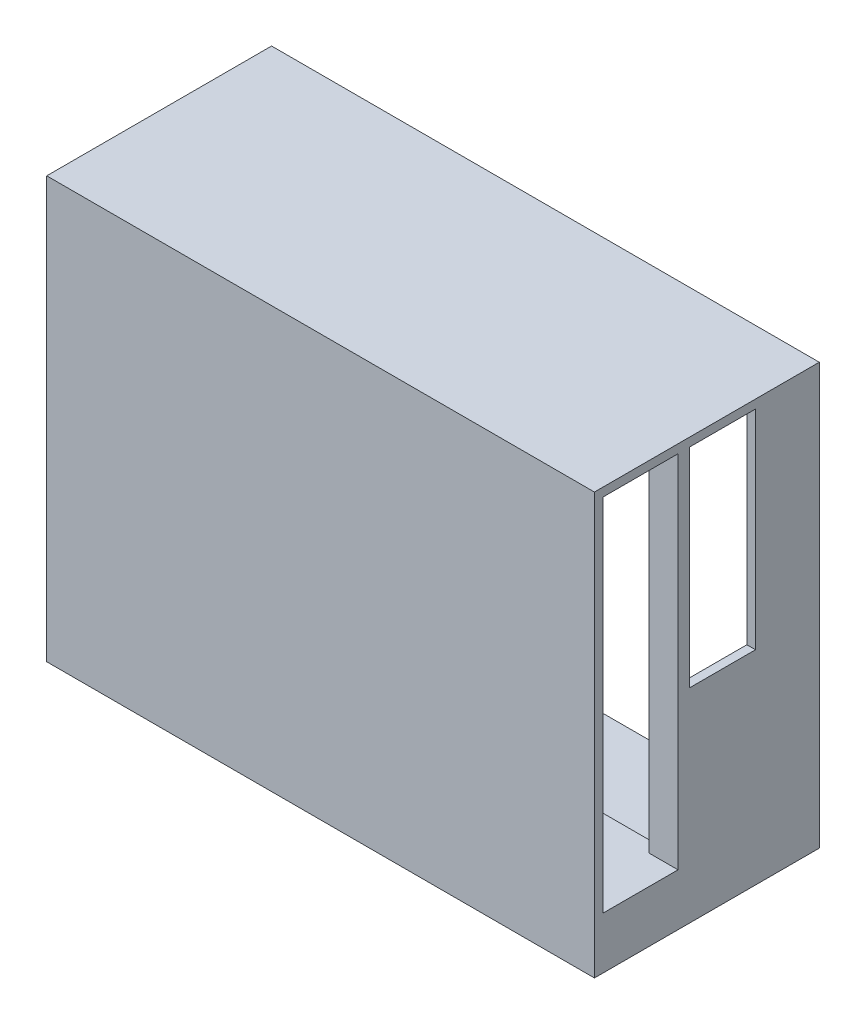
ISO-10303-21;
HEADER;
FILE_DESCRIPTION(('STEP AP214'),'2;1');
FILE_NAME('part.step','',(''),(''),'','','');
FILE_SCHEMA(('AUTOMOTIVE_DESIGN { 1 0 10303 214 1 1 1 1 }'));
ENDSEC;
DATA;
#1=APPLICATION_CONTEXT('core data for automotive mechanical design processes');
#2=APPLICATION_PROTOCOL_DEFINITION('international standard','automotive_design',2000,#1);
#3=PRODUCT_CONTEXT('',#1,'mechanical');
#4=PRODUCT('Part','Part','',(#3));
#5=PRODUCT_RELATED_PRODUCT_CATEGORY('part','',(#4));
#6=PRODUCT_DEFINITION_FORMATION('','',#4);
#7=PRODUCT_DEFINITION_CONTEXT('part definition',#1,'design');
#8=PRODUCT_DEFINITION('design','',#6,#7);
#9=PRODUCT_DEFINITION_SHAPE('','',#8);
#10=(LENGTH_UNIT() NAMED_UNIT(*) SI_UNIT(.MILLI.,.METRE.));
#11=(NAMED_UNIT(*) PLANE_ANGLE_UNIT() SI_UNIT($,.RADIAN.));
#12=(NAMED_UNIT(*) SI_UNIT($,.STERADIAN.) SOLID_ANGLE_UNIT());
#13=UNCERTAINTY_MEASURE_WITH_UNIT(LENGTH_MEASURE(1.E-05),#10,'distance_accuracy_value','');
#14=(GEOMETRIC_REPRESENTATION_CONTEXT(3) GLOBAL_UNCERTAINTY_ASSIGNED_CONTEXT((#13)) GLOBAL_UNIT_ASSIGNED_CONTEXT((#10,
#11,#12)) REPRESENTATION_CONTEXT('',''));
#15=CARTESIAN_POINT('',(0.,0.,0.));
#16=DIRECTION('',(0.,0.,1.));
#17=DIRECTION('',(1.,0.,0.));
#18=AXIS2_PLACEMENT_3D('',#15,#16,#17);
#19=CARTESIAN_POINT('',(95.,-70.,-75.));
#20=DIRECTION('',(0.,-1.,0.));
#21=DIRECTION('',(0.,0.,-1.));
#22=AXIS2_PLACEMENT_3D('',#19,#20,#21);
#23=PLANE('',#22);
#24=DIRECTION('',(1.,0.,0.));
#25=VECTOR('',#24,1.);
#26=CARTESIAN_POINT('',(95.,-70.,-27.));
#27=LINE('',#26,#25);
#28=CARTESIAN_POINT('',(-91.9998664938504,-70.,-27.));
#29=VERTEX_POINT('',#28);
#30=CARTESIAN_POINT('',(-47.,-70.,-27.));
#31=VERTEX_POINT('',#30);
#32=EDGE_CURVE('E241',#29,#31,#27,.T.);
#33=ORIENTED_EDGE('',*,*,#32,.F.);
#34=DIRECTION('',(0.,0.,-1.));
#35=VECTOR('',#34,1.);
#36=CARTESIAN_POINT('',(-91.9998664938504,-70.,-75.));
#37=LINE('',#36,#35);
#38=CARTESIAN_POINT('',(-91.9998664938504,-70.,-30.));
#39=VERTEX_POINT('',#38);
#40=EDGE_CURVE('E225',#29,#39,#37,.T.);
#41=ORIENTED_EDGE('',*,*,#40,.T.);
#42=DIRECTION('',(-1.,0.,0.));
#43=VECTOR('',#42,1.);
#44=CARTESIAN_POINT('',(-42.,-70.,-30.));
#45=LINE('',#44,#43);
#46=CARTESIAN_POINT('',(92.,-70.,-30.));
#47=VERTEX_POINT('',#46);
#48=EDGE_CURVE('E336',#47,#39,#45,.T.);
#49=ORIENTED_EDGE('',*,*,#48,.F.);
#50=DIRECTION('',(0.,0.,1.));
#51=VECTOR('',#50,1.);
#52=CARTESIAN_POINT('',(92.,-70.,-75.));
#53=LINE('',#52,#51);
#54=CARTESIAN_POINT('',(92.,-70.,-75.));
#55=VERTEX_POINT('',#54);
#56=EDGE_CURVE('E384',#55,#47,#53,.T.);
#57=ORIENTED_EDGE('',*,*,#56,.F.);
#58=DIRECTION('',(1.,0.,0.));
#59=VECTOR('',#58,1.);
#60=CARTESIAN_POINT('',(95.,-70.,-75.));
#61=LINE('',#60,#59);
#62=CARTESIAN_POINT('',(-92.,-70.,-75.));
#63=VERTEX_POINT('',#62);
#64=EDGE_CURVE('E414',#63,#55,#61,.T.);
#65=ORIENTED_EDGE('',*,*,#64,.F.);
#66=DIRECTION('',(0.,0.,1.));
#67=VECTOR('',#66,1.);
#68=CARTESIAN_POINT('',(-92.,-70.,-75.));
#69=LINE('',#68,#67);
#70=CARTESIAN_POINT('',(-92.,-70.,0.));
#71=VERTEX_POINT('',#70);
#72=EDGE_CURVE('E390',#63,#71,#69,.T.);
#73=ORIENTED_EDGE('',*,*,#72,.T.);
#74=DIRECTION('',(1.,0.,0.));
#75=VECTOR('',#74,1.);
#76=CARTESIAN_POINT('',(95.,-70.,0.));
#77=LINE('',#76,#75);
#78=CARTESIAN_POINT('',(-47.,-70.,0.));
#79=VERTEX_POINT('',#78);
#80=EDGE_CURVE('E409',#71,#79,#77,.T.);
#81=ORIENTED_EDGE('',*,*,#80,.T.);
#82=DIRECTION('',(0.,0.,1.));
#83=VECTOR('',#82,1.);
#84=CARTESIAN_POINT('',(-47.,-70.,-30.));
#85=LINE('',#84,#83);
#86=EDGE_CURVE('E342',#31,#79,#85,.T.);
#87=ORIENTED_EDGE('',*,*,#86,.F.);
#88=EDGE_LOOP('',(#33,#41,#49,#57,#65,#73,#81,#87));
#89=FACE_BOUND('',#88,.T.);
#90=ADVANCED_FACE('F36',(#89),#23,.F.);
#91=CARTESIAN_POINT('',(-47.,56.4195425973253,-30.));
#92=DIRECTION('',(1.,0.,0.));
#93=DIRECTION('',(0.,1.,0.));
#94=AXIS2_PLACEMENT_3D('',#91,#92,#93);
#95=PLANE('',#94);
#96=DIRECTION('',(0.,-1.,0.));
#97=VECTOR('',#96,1.);
#98=CARTESIAN_POINT('',(-47.,-59.642589744385,-27.));
#99=LINE('',#98,#97);
#100=CARTESIAN_POINT('',(-47.,-59.642589744385,-27.));
#101=VERTEX_POINT('',#100);
#102=EDGE_CURVE('E229',#101,#31,#99,.T.);
#103=ORIENTED_EDGE('',*,*,#102,.T.);
#104=ORIENTED_EDGE('',*,*,#86,.T.);
#105=DIRECTION('',(0.,1.,0.));
#106=VECTOR('',#105,1.);
#107=CARTESIAN_POINT('',(-47.,56.4195425973253,0.));
#108=LINE('',#107,#106);
#109=CARTESIAN_POINT('',(-47.,56.4195425973253,0.));
#110=VERTEX_POINT('',#109);
#111=EDGE_CURVE('E334',#79,#110,#108,.T.);
#112=ORIENTED_EDGE('',*,*,#111,.T.);
#113=DIRECTION('',(0.,0.,1.));
#114=VECTOR('',#113,1.);
#115=CARTESIAN_POINT('',(-47.,56.4195425973253,-30.));
#116=LINE('',#115,#114);
#117=CARTESIAN_POINT('',(-47.,56.4195425973253,-25.));
#118=VERTEX_POINT('',#117);
#119=EDGE_CURVE('E338',#118,#110,#116,.T.);
#120=ORIENTED_EDGE('',*,*,#119,.F.);
#121=DIRECTION('',(0.,-1.,0.));
#122=VECTOR('',#121,1.);
#123=CARTESIAN_POINT('',(-47.,56.4195425973253,-25.));
#124=LINE('',#123,#122);
#125=CARTESIAN_POINT('',(-47.,-59.642589744385,-25.));
#126=VERTEX_POINT('',#125);
#127=EDGE_CURVE('E324',#118,#126,#124,.T.);
#128=ORIENTED_EDGE('',*,*,#127,.T.);
#129=DIRECTION('',(0.,0.,-1.));
#130=VECTOR('',#129,1.);
#131=CARTESIAN_POINT('',(-47.,-59.642589744385,-25.));
#132=LINE('',#131,#130);
#133=EDGE_CURVE('E330',#126,#101,#132,.T.);
#134=ORIENTED_EDGE('',*,*,#133,.T.);
#135=EDGE_LOOP('',(#103,#104,#112,#120,#128,#134));
#136=FACE_BOUND('',#135,.T.);
#137=ADVANCED_FACE('F464',(#136),#95,.F.);
#138=CARTESIAN_POINT('',(92.,-70.,-75.));
#139=DIRECTION('',(1.,0.,0.));
#140=DIRECTION('',(0.,0.,-1.));
#141=AXIS2_PLACEMENT_3D('',#138,#139,#140);
#142=PLANE('',#141);
#143=DIRECTION('',(0.,-1.,0.));
#144=VECTOR('',#143,1.);
#145=CARTESIAN_POINT('',(92.,-70.,-30.));
#146=LINE('',#145,#144);
#147=CARTESIAN_POINT('',(92.,-2.32237524224388,-30.));
#148=VERTEX_POINT('',#147);
#149=EDGE_CURVE('E311',#148,#47,#146,.T.);
#150=ORIENTED_EDGE('',*,*,#149,.F.);
#151=DIRECTION('',(0.,0.,1.));
#152=VECTOR('',#151,1.);
#153=CARTESIAN_POINT('',(92.,-2.32237524224388,-30.));
#154=LINE('',#153,#152);
#155=CARTESIAN_POINT('',(92.,-2.32237524224388,-52.8810215341764));
#156=VERTEX_POINT('',#155);
#157=EDGE_CURVE('E259',#156,#148,#154,.T.);
#158=ORIENTED_EDGE('',*,*,#157,.F.);
#159=DIRECTION('',(0.,-1.,0.));
#160=VECTOR('',#159,1.);
#161=CARTESIAN_POINT('',(92.,70.,-52.8810215341764));
#162=LINE('',#161,#160);
#163=CARTESIAN_POINT('',(92.,70.,-52.8810215341764));
#164=VERTEX_POINT('',#163);
#165=EDGE_CURVE('E248',#164,#156,#162,.T.);
#166=ORIENTED_EDGE('',*,*,#165,.F.);
#167=DIRECTION('',(0.,0.,1.));
#168=VECTOR('',#167,1.);
#169=CARTESIAN_POINT('',(92.,70.,-75.));
#170=LINE('',#169,#168);
#171=CARTESIAN_POINT('',(92.,70.,-75.));
#172=VERTEX_POINT('',#171);
#173=EDGE_CURVE('E382',#172,#164,#170,.T.);
#174=ORIENTED_EDGE('',*,*,#173,.F.);
#175=DIRECTION('',(0.,1.,0.));
#176=VECTOR('',#175,1.);
#177=CARTESIAN_POINT('',(92.,-70.,-75.));
#178=LINE('',#177,#176);
#179=EDGE_CURVE('E379',#55,#172,#178,.T.);
#180=ORIENTED_EDGE('',*,*,#179,.F.);
#181=ORIENTED_EDGE('',*,*,#56,.T.);
#182=EDGE_LOOP('',(#150,#158,#166,#174,#180,#181));
#183=FACE_BOUND('',#182,.T.);
#184=ADVANCED_FACE('F471',(#183),#142,.F.);
#185=CARTESIAN_POINT('',(95.,70.,-75.));
#186=DIRECTION('',(0.,1.,0.));
#187=DIRECTION('',(-1.,0.,0.));
#188=AXIS2_PLACEMENT_3D('',#185,#186,#187);
#189=PLANE('',#188);
#190=DIRECTION('',(1.,0.,0.));
#191=VECTOR('',#190,1.);
#192=CARTESIAN_POINT('',(85.,70.,-30.));
#193=LINE('',#192,#191);
#194=CARTESIAN_POINT('',(85.,70.,-30.));
#195=VERTEX_POINT('',#194);
#196=CARTESIAN_POINT('',(95.,70.,-30.));
#197=VERTEX_POINT('',#196);
#198=EDGE_CURVE('E279',#195,#197,#193,.T.);
#199=ORIENTED_EDGE('',*,*,#198,.F.);
#200=DIRECTION('',(0.,0.,-1.));
#201=VECTOR('',#200,1.);
#202=CARTESIAN_POINT('',(85.,70.,-30.));
#203=LINE('',#202,#201);
#204=CARTESIAN_POINT('',(85.,70.,-26.));
#205=VERTEX_POINT('',#204);
#206=EDGE_CURVE('E276',#205,#195,#203,.T.);
#207=ORIENTED_EDGE('',*,*,#206,.F.);
#208=DIRECTION('',(-1.,0.,0.));
#209=VECTOR('',#208,1.);
#210=CARTESIAN_POINT('',(97.,70.,-26.));
#211=LINE('',#210,#209);
#212=CARTESIAN_POINT('',(95.,70.,-26.));
#213=VERTEX_POINT('',#212);
#214=EDGE_CURVE('E367',#213,#205,#211,.T.);
#215=ORIENTED_EDGE('',*,*,#214,.F.);
#216=DIRECTION('',(0.,0.,-1.));
#217=VECTOR('',#216,1.);
#218=CARTESIAN_POINT('',(95.,70.,3.));
#219=LINE('',#218,#217);
#220=CARTESIAN_POINT('',(95.,70.,0.));
#221=VERTEX_POINT('',#220);
#222=EDGE_CURVE('E370',#221,#213,#219,.T.);
#223=ORIENTED_EDGE('',*,*,#222,.F.);
#224=DIRECTION('',(-1.,0.,0.));
#225=VECTOR('',#224,1.);
#226=CARTESIAN_POINT('',(95.,70.,0.));
#227=LINE('',#226,#225);
#228=CARTESIAN_POINT('',(-42.,70.,0.));
#229=VERTEX_POINT('',#228);
#230=EDGE_CURVE('E396',#221,#229,#227,.T.);
#231=ORIENTED_EDGE('',*,*,#230,.T.);
#232=DIRECTION('',(0.,0.,1.));
#233=VECTOR('',#232,1.);
#234=CARTESIAN_POINT('',(-42.,70.,-30.));
#235=LINE('',#234,#233);
#236=CARTESIAN_POINT('',(-42.,70.,-30.));
#237=VERTEX_POINT('',#236);
#238=EDGE_CURVE('E364',#237,#229,#235,.T.);
#239=ORIENTED_EDGE('',*,*,#238,.F.);
#240=DIRECTION('',(1.,0.,0.));
#241=VECTOR('',#240,1.);
#242=CARTESIAN_POINT('',(-92.,70.,-30.));
#243=LINE('',#242,#241);
#244=CARTESIAN_POINT('',(-92.,70.,-30.));
#245=VERTEX_POINT('',#244);
#246=EDGE_CURVE('E350',#245,#237,#243,.T.);
#247=ORIENTED_EDGE('',*,*,#246,.F.);
#248=DIRECTION('',(0.,0.,1.));
#249=VECTOR('',#248,1.);
#250=CARTESIAN_POINT('',(-92.,70.,-75.));
#251=LINE('',#250,#249);
#252=CARTESIAN_POINT('',(-92.,70.,-75.));
#253=VERTEX_POINT('',#252);
#254=EDGE_CURVE('E394',#253,#245,#251,.T.);
#255=ORIENTED_EDGE('',*,*,#254,.F.);
#256=DIRECTION('',(-1.,0.,0.));
#257=VECTOR('',#256,1.);
#258=CARTESIAN_POINT('',(95.,70.,-75.));
#259=LINE('',#258,#257);
#260=EDGE_CURVE('E397',#172,#253,#259,.T.);
#261=ORIENTED_EDGE('',*,*,#260,.F.);
#262=ORIENTED_EDGE('',*,*,#173,.T.);
#263=DIRECTION('',(-1.,0.,0.));
#264=VECTOR('',#263,1.);
#265=CARTESIAN_POINT('',(170.855567410226,70.,-52.8810215341764));
#266=LINE('',#265,#264);
#267=CARTESIAN_POINT('',(95.,70.,-52.8810215341764));
#268=VERTEX_POINT('',#267);
#269=EDGE_CURVE('E60',#268,#164,#266,.T.);
#270=ORIENTED_EDGE('',*,*,#269,.F.);
#271=DIRECTION('',(0.,0.,1.));
#272=VECTOR('',#271,1.);
#273=CARTESIAN_POINT('',(95.,70.,-30.));
#274=LINE('',#273,#272);
#275=EDGE_CURVE('E256',#268,#197,#274,.T.);
#276=ORIENTED_EDGE('',*,*,#275,.T.);
#277=EDGE_LOOP('',(#199,#207,#215,#223,#231,#239,#247,#255,#261,#262,#270,#276));
#278=FACE_BOUND('',#277,.T.);
#279=ADVANCED_FACE('F508',(#278),#189,.F.);
#280=CARTESIAN_POINT('',(-42.,-55.,-30.));
#281=DIRECTION('',(0.,-1.,0.));
#282=DIRECTION('',(1.,0.,0.));
#283=AXIS2_PLACEMENT_3D('',#280,#281,#282);
#284=PLANE('',#283);
#285=DIRECTION('',(-1.,0.,0.));
#286=VECTOR('',#285,1.);
#287=CARTESIAN_POINT('',(97.,-55.,-26.));
#288=LINE('',#287,#286);
#289=CARTESIAN_POINT('',(95.,-55.,-26.));
#290=VERTEX_POINT('',#289);
#291=CARTESIAN_POINT('',(85.,-55.,-26.));
#292=VERTEX_POINT('',#291);
#293=EDGE_CURVE('E316',#290,#292,#288,.T.);
#294=ORIENTED_EDGE('',*,*,#293,.T.);
#295=DIRECTION('',(0.,0.,1.));
#296=VECTOR('',#295,1.);
#297=CARTESIAN_POINT('',(85.,-55.,-30.));
#298=LINE('',#297,#296);
#299=CARTESIAN_POINT('',(85.,-55.,-30.));
#300=VERTEX_POINT('',#299);
#301=EDGE_CURVE('E270',#300,#292,#298,.T.);
#302=ORIENTED_EDGE('',*,*,#301,.F.);
#303=DIRECTION('',(1.,0.,0.));
#304=VECTOR('',#303,1.);
#305=CARTESIAN_POINT('',(-42.,-55.,-30.));
#306=LINE('',#305,#304);
#307=CARTESIAN_POINT('',(-42.,-55.,-30.));
#308=VERTEX_POINT('',#307);
#309=EDGE_CURVE('E297',#308,#300,#306,.T.);
#310=ORIENTED_EDGE('',*,*,#309,.F.);
#311=DIRECTION('',(0.,0.,1.));
#312=VECTOR('',#311,1.);
#313=CARTESIAN_POINT('',(-42.,-55.,-30.));
#314=LINE('',#313,#312);
#315=CARTESIAN_POINT('',(-42.,-55.,0.));
#316=VERTEX_POINT('',#315);
#317=EDGE_CURVE('E309',#308,#316,#314,.T.);
#318=ORIENTED_EDGE('',*,*,#317,.T.);
#319=DIRECTION('',(1.,0.,0.));
#320=VECTOR('',#319,1.);
#321=CARTESIAN_POINT('',(-42.,-55.,0.));
#322=LINE('',#321,#320);
#323=CARTESIAN_POINT('',(95.,-55.,0.));
#324=VERTEX_POINT('',#323);
#325=EDGE_CURVE('E296',#316,#324,#322,.T.);
#326=ORIENTED_EDGE('',*,*,#325,.T.);
#327=DIRECTION('',(0.,0.,1.));
#328=VECTOR('',#327,1.);
#329=CARTESIAN_POINT('',(95.,-55.,-30.));
#330=LINE('',#329,#328);
#331=EDGE_CURVE('E307',#290,#324,#330,.T.);
#332=ORIENTED_EDGE('',*,*,#331,.F.);
#333=EDGE_LOOP('',(#294,#302,#310,#318,#326,#332));
#334=FACE_BOUND('',#333,.T.);
#335=ADVANCED_FACE('F504',(#334),#284,.F.);
#336=CARTESIAN_POINT('',(0.,0.,0.));
#337=DIRECTION('',(0.,0.,-1.));
#338=DIRECTION('',(-1.,0.,0.));
#339=AXIS2_PLACEMENT_3D('',#336,#337,#338);
#340=PLANE('',#339);
#341=DIRECTION('',(0.,1.,0.));
#342=VECTOR('',#341,1.);
#343=CARTESIAN_POINT('',(95.,73.,0.));
#344=LINE('',#343,#342);
#345=EDGE_CURVE('E377',#324,#221,#344,.T.);
#346=ORIENTED_EDGE('',*,*,#345,.F.);
#347=ORIENTED_EDGE('',*,*,#325,.F.);
#348=DIRECTION('',(0.,-1.,0.));
#349=VECTOR('',#348,1.);
#350=CARTESIAN_POINT('',(-42.,70.,0.));
#351=LINE('',#350,#349);
#352=EDGE_CURVE('E358',#229,#316,#351,.T.);
#353=ORIENTED_EDGE('',*,*,#352,.F.);
#354=ORIENTED_EDGE('',*,*,#230,.F.);
#355=EDGE_LOOP('',(#346,#347,#353,#354));
#356=FACE_BOUND('',#355,.T.);
#357=ADVANCED_FACE('F507',(#356),#340,.T.);
#358=CARTESIAN_POINT('',(97.,-70.,-26.));
#359=DIRECTION('',(0.,0.,-1.));
#360=DIRECTION('',(-1.,0.,0.));
#361=AXIS2_PLACEMENT_3D('',#358,#359,#360);
#362=PLANE('',#361);
#363=ORIENTED_EDGE('',*,*,#293,.F.);
#364=DIRECTION('',(0.,-1.,0.));
#365=VECTOR('',#364,1.);
#366=CARTESIAN_POINT('',(95.,73.,-26.));
#367=LINE('',#366,#365);
#368=EDGE_CURVE('E374',#213,#290,#367,.T.);
#369=ORIENTED_EDGE('',*,*,#368,.F.);
#370=ORIENTED_EDGE('',*,*,#214,.T.);
#371=DIRECTION('',(0.,1.,0.));
#372=VECTOR('',#371,1.);
#373=CARTESIAN_POINT('',(85.,-55.,-26.));
#374=LINE('',#373,#372);
#375=EDGE_CURVE('E273',#292,#205,#374,.T.);
#376=ORIENTED_EDGE('',*,*,#375,.F.);
#377=EDGE_LOOP('',(#363,#369,#370,#376));
#378=FACE_BOUND('',#377,.T.);
#379=ADVANCED_FACE('F525',(#378),#362,.F.);
#380=CARTESIAN_POINT('',(-42.,70.,-30.));
#381=DIRECTION('',(-1.,0.,0.));
#382=DIRECTION('',(0.,-1.,0.));
#383=AXIS2_PLACEMENT_3D('',#380,#381,#382);
#384=PLANE('',#383);
#385=ORIENTED_EDGE('',*,*,#317,.F.);
#386=DIRECTION('',(0.,-1.,0.));
#387=VECTOR('',#386,1.);
#388=CARTESIAN_POINT('',(-42.,70.,-30.));
#389=LINE('',#388,#387);
#390=EDGE_CURVE('E354',#237,#308,#389,.T.);
#391=ORIENTED_EDGE('',*,*,#390,.F.);
#392=ORIENTED_EDGE('',*,*,#238,.T.);
#393=ORIENTED_EDGE('',*,*,#352,.T.);
#394=EDGE_LOOP('',(#385,#391,#392,#393));
#395=FACE_BOUND('',#394,.T.);
#396=ADVANCED_FACE('F499',(#395),#384,.F.);
#397=DIRECTION('',(-1.,0.,0.));
#398=VECTOR('',#397,1.);
#399=CARTESIAN_POINT('',(-92.,56.4195425973253,0.));
#400=LINE('',#399,#398);
#401=CARTESIAN_POINT('',(-92.,56.4195425973253,0.));
#402=VERTEX_POINT('',#401);
#403=EDGE_CURVE('E351',#110,#402,#400,.T.);
#404=ORIENTED_EDGE('',*,*,#403,.F.);
#405=ORIENTED_EDGE('',*,*,#111,.F.);
#406=ORIENTED_EDGE('',*,*,#80,.F.);
#407=DIRECTION('',(0.,-1.,0.));
#408=VECTOR('',#407,1.);
#409=CARTESIAN_POINT('',(-92.,-70.,0.));
#410=LINE('',#409,#408);
#411=EDGE_CURVE('E387',#402,#71,#410,.T.);
#412=ORIENTED_EDGE('',*,*,#411,.F.);
#413=EDGE_LOOP('',(#404,#405,#406,#412));
#414=FACE_BOUND('',#413,.T.);
#415=ADVANCED_FACE('F521',(#414),#340,.T.);
#416=CARTESIAN_POINT('',(-92.,56.4195425973253,-30.));
#417=DIRECTION('',(0.,1.,0.));
#418=DIRECTION('',(-1.,0.,0.));
#419=AXIS2_PLACEMENT_3D('',#416,#417,#418);
#420=PLANE('',#419);
#421=DIRECTION('',(0.,0.,1.));
#422=VECTOR('',#421,1.);
#423=CARTESIAN_POINT('',(-92.,56.4195425973253,-30.));
#424=LINE('',#423,#422);
#425=CARTESIAN_POINT('',(-92.,56.4195425973253,-25.));
#426=VERTEX_POINT('',#425);
#427=EDGE_CURVE('E357',#426,#402,#424,.T.);
#428=ORIENTED_EDGE('',*,*,#427,.F.);
#429=DIRECTION('',(1.,0.,0.));
#430=VECTOR('',#429,1.);
#431=CARTESIAN_POINT('',(-92.,56.4195425973253,-25.));
#432=LINE('',#431,#430);
#433=EDGE_CURVE('E321',#426,#118,#432,.T.);
#434=ORIENTED_EDGE('',*,*,#433,.T.);
#435=ORIENTED_EDGE('',*,*,#119,.T.);
#436=ORIENTED_EDGE('',*,*,#403,.T.);
#437=EDGE_LOOP('',(#428,#434,#435,#436));
#438=FACE_BOUND('',#437,.T.);
#439=ADVANCED_FACE('F460',(#438),#420,.F.);
#440=CARTESIAN_POINT('',(-92.,-70.,-75.));
#441=DIRECTION('',(-1.,0.,0.));
#442=DIRECTION('',(0.,-1.,0.));
#443=AXIS2_PLACEMENT_3D('',#440,#441,#442);
#444=PLANE('',#443);
#445=DIRECTION('',(0.,0.,-1.));
#446=VECTOR('',#445,1.);
#447=CARTESIAN_POINT('',(-92.,-59.642589744385,-25.));
#448=LINE('',#447,#446);
#449=CARTESIAN_POINT('',(-92.,-59.642589744385,-25.));
#450=VERTEX_POINT('',#449);
#451=CARTESIAN_POINT('',(-92.,-59.642589744385,-30.));
#452=VERTEX_POINT('',#451);
#453=EDGE_CURVE('E332',#450,#452,#448,.T.);
#454=ORIENTED_EDGE('',*,*,#453,.F.);
#455=DIRECTION('',(0.,1.,0.));
#456=VECTOR('',#455,1.);
#457=CARTESIAN_POINT('',(-92.,56.4195425973253,-25.));
#458=LINE('',#457,#456);
#459=EDGE_CURVE('E318',#450,#426,#458,.T.);
#460=ORIENTED_EDGE('',*,*,#459,.T.);
#461=ORIENTED_EDGE('',*,*,#427,.T.);
#462=ORIENTED_EDGE('',*,*,#411,.T.);
#463=ORIENTED_EDGE('',*,*,#72,.F.);
#464=DIRECTION('',(0.,-1.,0.));
#465=VECTOR('',#464,1.);
#466=CARTESIAN_POINT('',(-92.,-70.,-75.));
#467=LINE('',#466,#465);
#468=EDGE_CURVE('E388',#253,#63,#467,.T.);
#469=ORIENTED_EDGE('',*,*,#468,.F.);
#470=ORIENTED_EDGE('',*,*,#254,.T.);
#471=DIRECTION('',(0.,1.,0.));
#472=VECTOR('',#471,1.);
#473=CARTESIAN_POINT('',(-92.,70.,-30.));
#474=LINE('',#473,#472);
#475=EDGE_CURVE('E347',#452,#245,#474,.T.);
#476=ORIENTED_EDGE('',*,*,#475,.F.);
#477=EDGE_LOOP('',(#454,#460,#461,#462,#463,#469,#470,#476));
#478=FACE_BOUND('',#477,.T.);
#479=ADVANCED_FACE('F455',(#478),#444,.F.);
#480=CARTESIAN_POINT('',(-95.,73.,3.));
#481=DIRECTION('',(1.,0.,0.));
#482=DIRECTION('',(0.,1.,0.));
#483=AXIS2_PLACEMENT_3D('',#480,#481,#482);
#484=PLANE('',#483);
#485=DIRECTION('',(0.,0.,-1.));
#486=VECTOR('',#485,1.);
#487=CARTESIAN_POINT('',(-95.,73.,3.));
#488=LINE('',#487,#486);
#489=CARTESIAN_POINT('',(-95.,73.,3.));
#490=VERTEX_POINT('',#489);
#491=CARTESIAN_POINT('',(-95.,73.,-75.));
#492=VERTEX_POINT('',#491);
#493=EDGE_CURVE('E428',#490,#492,#488,.T.);
#494=ORIENTED_EDGE('',*,*,#493,.T.);
#495=DIRECTION('',(0.,1.,0.));
#496=VECTOR('',#495,1.);
#497=CARTESIAN_POINT('',(-95.,-73.,-75.));
#498=LINE('',#497,#496);
#499=CARTESIAN_POINT('',(-95.,-73.,-75.));
#500=VERTEX_POINT('',#499);
#501=EDGE_CURVE('E412',#500,#492,#498,.T.);
#502=ORIENTED_EDGE('',*,*,#501,.F.);
#503=DIRECTION('',(0.,0.,-1.));
#504=VECTOR('',#503,1.);
#505=CARTESIAN_POINT('',(-95.,-73.,3.));
#506=LINE('',#505,#504);
#507=CARTESIAN_POINT('',(-95.,-73.,3.));
#508=VERTEX_POINT('',#507);
#509=EDGE_CURVE('E11',#508,#500,#506,.T.);
#510=ORIENTED_EDGE('',*,*,#509,.F.);
#511=DIRECTION('',(0.,-1.,0.));
#512=VECTOR('',#511,1.);
#513=CARTESIAN_POINT('',(-95.,73.,3.));
#514=LINE('',#513,#512);
#515=EDGE_CURVE('E417',#490,#508,#514,.T.);
#516=ORIENTED_EDGE('',*,*,#515,.F.);
#517=EDGE_LOOP('',(#494,#502,#510,#516));
#518=FACE_BOUND('',#517,.T.);
#519=ADVANCED_FACE('F38',(#518),#484,.F.);
#520=CARTESIAN_POINT('',(95.,-73.,3.));
#521=DIRECTION('',(0.,1.,0.));
#522=DIRECTION('',(-1.,0.,0.));
#523=AXIS2_PLACEMENT_3D('',#520,#521,#522);
#524=PLANE('',#523);
#525=ORIENTED_EDGE('',*,*,#509,.T.);
#526=DIRECTION('',(-1.,0.,0.));
#527=VECTOR('',#526,1.);
#528=CARTESIAN_POINT('',(95.,-73.,-75.));
#529=LINE('',#528,#527);
#530=CARTESIAN_POINT('',(95.,-73.,-75.));
#531=VERTEX_POINT('',#530);
#532=EDGE_CURVE('E408',#531,#500,#529,.T.);
#533=ORIENTED_EDGE('',*,*,#532,.F.);
#534=DIRECTION('',(0.,0.,-1.));
#535=VECTOR('',#534,1.);
#536=CARTESIAN_POINT('',(95.,-73.,3.));
#537=LINE('',#536,#535);
#538=CARTESIAN_POINT('',(95.,-73.,3.));
#539=VERTEX_POINT('',#538);
#540=EDGE_CURVE('E45',#539,#531,#537,.T.);
#541=ORIENTED_EDGE('',*,*,#540,.F.);
#542=DIRECTION('',(1.,0.,0.));
#543=VECTOR('',#542,1.);
#544=CARTESIAN_POINT('',(95.,-73.,3.));
#545=LINE('',#544,#543);
#546=EDGE_CURVE('E422',#508,#539,#545,.T.);
#547=ORIENTED_EDGE('',*,*,#546,.F.);
#548=EDGE_LOOP('',(#525,#533,#541,#547));
#549=FACE_BOUND('',#548,.T.);
#550=ADVANCED_FACE('F440',(#549),#524,.F.);
#551=CARTESIAN_POINT('',(95.,73.,3.));
#552=DIRECTION('',(-1.,0.,0.));
#553=DIRECTION('',(0.,-1.,0.));
#554=AXIS2_PLACEMENT_3D('',#551,#552,#553);
#555=PLANE('',#554);
#556=DIRECTION('',(0.,0.,-1.));
#557=VECTOR('',#556,1.);
#558=CARTESIAN_POINT('',(95.,-2.32237524224388,-30.));
#559=LINE('',#558,#557);
#560=CARTESIAN_POINT('',(95.,-2.32237524224388,-30.));
#561=VERTEX_POINT('',#560);
#562=CARTESIAN_POINT('',(95.,-2.32237524224388,-52.8810215341764));
#563=VERTEX_POINT('',#562);
#564=EDGE_CURVE('E251',#561,#563,#559,.T.);
#565=ORIENTED_EDGE('',*,*,#564,.F.);
#566=DIRECTION('',(0.,-1.,0.));
#567=VECTOR('',#566,1.);
#568=CARTESIAN_POINT('',(95.,70.,-30.));
#569=LINE('',#568,#567);
#570=EDGE_CURVE('E254',#197,#561,#569,.T.);
#571=ORIENTED_EDGE('',*,*,#570,.F.);
#572=ORIENTED_EDGE('',*,*,#275,.F.);
#573=DIRECTION('',(0.,1.,0.));
#574=VECTOR('',#573,1.);
#575=CARTESIAN_POINT('',(95.,70.,-52.8810215341764));
#576=LINE('',#575,#574);
#577=EDGE_CURVE('E249',#563,#268,#576,.T.);
#578=ORIENTED_EDGE('',*,*,#577,.F.);
#579=EDGE_LOOP('',(#565,#571,#572,#578));
#580=FACE_BOUND('',#579,.T.);
#581=ORIENTED_EDGE('',*,*,#368,.T.);
#582=ORIENTED_EDGE('',*,*,#331,.T.);
#583=ORIENTED_EDGE('',*,*,#345,.T.);
#584=ORIENTED_EDGE('',*,*,#222,.T.);
#585=EDGE_LOOP('',(#581,#582,#583,#584));
#586=FACE_BOUND('',#585,.T.);
#587=ORIENTED_EDGE('',*,*,#540,.T.);
#588=DIRECTION('',(0.,-1.,0.));
#589=VECTOR('',#588,1.);
#590=CARTESIAN_POINT('',(95.,-73.,-75.));
#591=LINE('',#590,#589);
#592=CARTESIAN_POINT('',(95.,73.,-75.));
#593=VERTEX_POINT('',#592);
#594=EDGE_CURVE('E405',#593,#531,#591,.T.);
#595=ORIENTED_EDGE('',*,*,#594,.F.);
#596=DIRECTION('',(0.,0.,-1.));
#597=VECTOR('',#596,1.);
#598=CARTESIAN_POINT('',(95.,73.,3.));
#599=LINE('',#598,#597);
#600=CARTESIAN_POINT('',(95.,73.,3.));
#601=VERTEX_POINT('',#600);
#602=EDGE_CURVE('E431',#601,#593,#599,.T.);
#603=ORIENTED_EDGE('',*,*,#602,.F.);
#604=DIRECTION('',(0.,1.,0.));
#605=VECTOR('',#604,1.);
#606=CARTESIAN_POINT('',(95.,73.,3.));
#607=LINE('',#606,#605);
#608=EDGE_CURVE('E424',#539,#601,#607,.T.);
#609=ORIENTED_EDGE('',*,*,#608,.F.);
#610=EDGE_LOOP('',(#587,#595,#603,#609));
#611=FACE_BOUND('',#610,.T.);
#612=ADVANCED_FACE('F437',(#580,#586,#611),#555,.F.);
#613=CARTESIAN_POINT('',(95.,73.,3.));
#614=DIRECTION('',(0.,-1.,0.));
#615=DIRECTION('',(1.,0.,0.));
#616=AXIS2_PLACEMENT_3D('',#613,#614,#615);
#617=PLANE('',#616);
#618=ORIENTED_EDGE('',*,*,#602,.T.);
#619=DIRECTION('',(1.,0.,0.));
#620=VECTOR('',#619,1.);
#621=CARTESIAN_POINT('',(95.,73.,-75.));
#622=LINE('',#621,#620);
#623=EDGE_CURVE('E399',#492,#593,#622,.T.);
#624=ORIENTED_EDGE('',*,*,#623,.F.);
#625=ORIENTED_EDGE('',*,*,#493,.F.);
#626=DIRECTION('',(-1.,0.,0.));
#627=VECTOR('',#626,1.);
#628=CARTESIAN_POINT('',(95.,73.,3.));
#629=LINE('',#628,#627);
#630=EDGE_CURVE('E426',#601,#490,#629,.T.);
#631=ORIENTED_EDGE('',*,*,#630,.F.);
#632=EDGE_LOOP('',(#618,#624,#625,#631));
#633=FACE_BOUND('',#632,.T.);
#634=ADVANCED_FACE('F448',(#633),#617,.F.);
#635=CARTESIAN_POINT('',(0.,0.,3.));
#636=DIRECTION('',(0.,0.,-1.));
#637=DIRECTION('',(-1.,0.,0.));
#638=AXIS2_PLACEMENT_3D('',#635,#636,#637);
#639=PLANE('',#638);
#640=ORIENTED_EDGE('',*,*,#515,.T.);
#641=ORIENTED_EDGE('',*,*,#546,.T.);
#642=ORIENTED_EDGE('',*,*,#608,.T.);
#643=ORIENTED_EDGE('',*,*,#630,.T.);
#644=EDGE_LOOP('',(#640,#641,#642,#643));
#645=FACE_BOUND('',#644,.T.);
#646=ADVANCED_FACE('F452',(#645),#639,.F.);
#647=CARTESIAN_POINT('',(0.,0.,-75.));
#648=DIRECTION('',(0.,0.,1.));
#649=DIRECTION('',(1.,0.,0.));
#650=AXIS2_PLACEMENT_3D('',#647,#648,#649);
#651=PLANE('',#650);
#652=ORIENTED_EDGE('',*,*,#64,.T.);
#653=ORIENTED_EDGE('',*,*,#179,.T.);
#654=ORIENTED_EDGE('',*,*,#260,.T.);
#655=ORIENTED_EDGE('',*,*,#468,.T.);
#656=EDGE_LOOP('',(#652,#653,#654,#655));
#657=FACE_BOUND('',#656,.T.);
#658=ORIENTED_EDGE('',*,*,#594,.T.);
#659=ORIENTED_EDGE('',*,*,#532,.T.);
#660=ORIENTED_EDGE('',*,*,#501,.T.);
#661=ORIENTED_EDGE('',*,*,#623,.T.);
#662=EDGE_LOOP('',(#658,#659,#660,#661));
#663=FACE_BOUND('',#662,.T.);
#664=ADVANCED_FACE('F444',(#657,#663),#651,.F.);
#665=CARTESIAN_POINT('',(0.,0.,-30.));
#666=DIRECTION('',(0.,0.,1.));
#667=DIRECTION('',(1.,0.,0.));
#668=AXIS2_PLACEMENT_3D('',#665,#666,#667);
#669=PLANE('',#668);
#670=ORIENTED_EDGE('',*,*,#198,.T.);
#671=ORIENTED_EDGE('',*,*,#570,.T.);
#672=DIRECTION('',(-1.,0.,0.));
#673=VECTOR('',#672,1.);
#674=CARTESIAN_POINT('',(170.855567410226,-2.32237524224388,-30.));
#675=LINE('',#674,#673);
#676=EDGE_CURVE('E252',#561,#148,#675,.T.);
#677=ORIENTED_EDGE('',*,*,#676,.T.);
#678=ORIENTED_EDGE('',*,*,#149,.T.);
#679=ORIENTED_EDGE('',*,*,#48,.T.);
#680=DIRECTION('',(0.,1.,0.));
#681=VECTOR('',#680,1.);
#682=CARTESIAN_POINT('',(-91.9998664938504,-59.642589744385,-30.));
#683=LINE('',#682,#681);
#684=CARTESIAN_POINT('',(-91.9998664938504,-59.642589744385,-30.));
#685=VERTEX_POINT('',#684);
#686=EDGE_CURVE('E245',#39,#685,#683,.T.);
#687=ORIENTED_EDGE('',*,*,#686,.T.);
#688=DIRECTION('',(-1.,0.,0.));
#689=VECTOR('',#688,1.);
#690=CARTESIAN_POINT('',(-92.,-59.642589744385,-30.));
#691=LINE('',#690,#689);
#692=EDGE_CURVE('E240',#685,#452,#691,.T.);
#693=ORIENTED_EDGE('',*,*,#692,.T.);
#694=ORIENTED_EDGE('',*,*,#475,.T.);
#695=ORIENTED_EDGE('',*,*,#246,.T.);
#696=ORIENTED_EDGE('',*,*,#390,.T.);
#697=ORIENTED_EDGE('',*,*,#309,.T.);
#698=DIRECTION('',(0.,-1.,0.));
#699=VECTOR('',#698,1.);
#700=CARTESIAN_POINT('',(85.,-55.,-30.));
#701=LINE('',#700,#699);
#702=EDGE_CURVE('E267',#195,#300,#701,.T.);
#703=ORIENTED_EDGE('',*,*,#702,.F.);
#704=EDGE_LOOP('',(#670,#671,#677,#678,#679,#687,#693,#694,#695,#696,#697,#703));
#705=FACE_BOUND('',#704,.T.);
#706=ADVANCED_FACE('F515',(#705),#669,.F.);
#707=CARTESIAN_POINT('',(-92.,-59.642589744385,-25.));
#708=DIRECTION('',(0.,-1.,0.));
#709=DIRECTION('',(1.,0.,0.));
#710=AXIS2_PLACEMENT_3D('',#707,#708,#709);
#711=PLANE('',#710);
#712=DIRECTION('',(0.,0.,-1.));
#713=VECTOR('',#712,1.);
#714=CARTESIAN_POINT('',(-91.9998664938504,-59.642589744385,-27.));
#715=LINE('',#714,#713);
#716=CARTESIAN_POINT('',(-91.9998664938504,-59.642589744385,-27.));
#717=VERTEX_POINT('',#716);
#718=EDGE_CURVE('E52',#717,#685,#715,.T.);
#719=ORIENTED_EDGE('',*,*,#718,.F.);
#720=DIRECTION('',(1.,0.,0.));
#721=VECTOR('',#720,1.);
#722=CARTESIAN_POINT('',(-47.,-59.642589744385,-27.));
#723=LINE('',#722,#721);
#724=EDGE_CURVE('E228',#717,#101,#723,.T.);
#725=ORIENTED_EDGE('',*,*,#724,.T.);
#726=ORIENTED_EDGE('',*,*,#133,.F.);
#727=DIRECTION('',(-1.,0.,0.));
#728=VECTOR('',#727,1.);
#729=CARTESIAN_POINT('',(-92.,-59.642589744385,-25.));
#730=LINE('',#729,#728);
#731=EDGE_CURVE('E327',#126,#450,#730,.T.);
#732=ORIENTED_EDGE('',*,*,#731,.T.);
#733=ORIENTED_EDGE('',*,*,#453,.T.);
#734=ORIENTED_EDGE('',*,*,#692,.F.);
#735=EDGE_LOOP('',(#719,#725,#726,#732,#733,#734));
#736=FACE_BOUND('',#735,.T.);
#737=ADVANCED_FACE('F238',(#736),#711,.T.);
#738=CARTESIAN_POINT('',(0.,0.,-25.));
#739=DIRECTION('',(0.,0.,1.));
#740=DIRECTION('',(1.,0.,0.));
#741=AXIS2_PLACEMENT_3D('',#738,#739,#740);
#742=PLANE('',#741);
#743=ORIENTED_EDGE('',*,*,#459,.F.);
#744=ORIENTED_EDGE('',*,*,#731,.F.);
#745=ORIENTED_EDGE('',*,*,#127,.F.);
#746=ORIENTED_EDGE('',*,*,#433,.F.);
#747=EDGE_LOOP('',(#743,#744,#745,#746));
#748=FACE_BOUND('',#747,.T.);
#749=ADVANCED_FACE('F510',(#748),#742,.T.);
#750=CARTESIAN_POINT('',(85.,0.,0.));
#751=DIRECTION('',(1.,0.,0.));
#752=DIRECTION('',(0.,0.,-1.));
#753=AXIS2_PLACEMENT_3D('',#750,#751,#752);
#754=PLANE('',#753);
#755=ORIENTED_EDGE('',*,*,#702,.T.);
#756=ORIENTED_EDGE('',*,*,#301,.T.);
#757=ORIENTED_EDGE('',*,*,#375,.T.);
#758=ORIENTED_EDGE('',*,*,#206,.T.);
#759=EDGE_LOOP('',(#755,#756,#757,#758));
#760=FACE_BOUND('',#759,.T.);
#761=ADVANCED_FACE('F501',(#760),#754,.F.);
#762=CARTESIAN_POINT('',(170.855567410226,-2.32237524224388,-30.));
#763=DIRECTION('',(0.,-1.,0.));
#764=DIRECTION('',(0.,0.,-1.));
#765=AXIS2_PLACEMENT_3D('',#762,#763,#764);
#766=PLANE('',#765);
#767=ORIENTED_EDGE('',*,*,#564,.T.);
#768=DIRECTION('',(-1.,0.,0.));
#769=VECTOR('',#768,1.);
#770=CARTESIAN_POINT('',(170.855567410226,-2.32237524224388,-52.8810215341764));
#771=LINE('',#770,#769);
#772=EDGE_CURVE('E263',#563,#156,#771,.T.);
#773=ORIENTED_EDGE('',*,*,#772,.T.);
#774=ORIENTED_EDGE('',*,*,#157,.T.);
#775=ORIENTED_EDGE('',*,*,#676,.F.);
#776=EDGE_LOOP('',(#767,#773,#774,#775));
#777=FACE_BOUND('',#776,.T.);
#778=ADVANCED_FACE('F565',(#777),#766,.F.);
#779=CARTESIAN_POINT('',(170.855567410226,70.,-52.8810215341764));
#780=DIRECTION('',(0.,0.,-1.));
#781=DIRECTION('',(0.,1.,0.));
#782=AXIS2_PLACEMENT_3D('',#779,#780,#781);
#783=PLANE('',#782);
#784=ORIENTED_EDGE('',*,*,#577,.T.);
#785=ORIENTED_EDGE('',*,*,#269,.T.);
#786=ORIENTED_EDGE('',*,*,#165,.T.);
#787=ORIENTED_EDGE('',*,*,#772,.F.);
#788=EDGE_LOOP('',(#784,#785,#786,#787));
#789=FACE_BOUND('',#788,.T.);
#790=ADVANCED_FACE('F572',(#789),#783,.F.);
#791=CARTESIAN_POINT('',(-91.9998664938504,-59.642589744385,-27.));
#792=DIRECTION('',(-1.,0.,0.));
#793=DIRECTION('',(0.,0.,1.));
#794=AXIS2_PLACEMENT_3D('',#791,#792,#793);
#795=PLANE('',#794);
#796=ORIENTED_EDGE('',*,*,#40,.F.);
#797=DIRECTION('',(0.,1.,0.));
#798=VECTOR('',#797,1.);
#799=CARTESIAN_POINT('',(-91.9998664938504,-59.642589744385,-27.));
#800=LINE('',#799,#798);
#801=EDGE_CURVE('E221',#29,#717,#800,.T.);
#802=ORIENTED_EDGE('',*,*,#801,.T.);
#803=ORIENTED_EDGE('',*,*,#718,.T.);
#804=ORIENTED_EDGE('',*,*,#686,.F.);
#805=EDGE_LOOP('',(#796,#802,#803,#804));
#806=FACE_BOUND('',#805,.T.);
#807=ADVANCED_FACE('F223',(#806),#795,.T.);
#808=CARTESIAN_POINT('',(0.,0.,-27.));
#809=DIRECTION('',(0.,0.,-1.));
#810=DIRECTION('',(-1.,0.,0.));
#811=AXIS2_PLACEMENT_3D('',#808,#809,#810);
#812=PLANE('',#811);
#813=ORIENTED_EDGE('',*,*,#801,.F.);
#814=ORIENTED_EDGE('',*,*,#32,.T.);
#815=ORIENTED_EDGE('',*,*,#102,.F.);
#816=ORIENTED_EDGE('',*,*,#724,.F.);
#817=EDGE_LOOP('',(#813,#814,#815,#816));
#818=FACE_BOUND('',#817,.T.);
#819=ADVANCED_FACE('F232',(#818),#812,.F.);
#820=CLOSED_SHELL('',(#90,#137,#184,#279,#335,#357,#379,#396,#415,#439,#479,#519,#550,#612,#634,
#646,#664,#706,#737,#749,#761,#778,#790,#807,#819));
#821=CARTESIAN_POINT('',(90.,0.,0.));
#822=DIRECTION('',(-1.,0.,0.));
#823=DIRECTION('',(0.,0.,1.));
#824=AXIS2_PLACEMENT_3D('',#821,#822,#823);
#825=PLANE('',#824);
#826=DIRECTION('',(0.,1.,0.));
#827=VECTOR('',#826,1.);
#828=CARTESIAN_POINT('',(90.,-60.,-26.));
#829=LINE('',#828,#827);
#830=CARTESIAN_POINT('',(90.,-70.,-26.));
#831=VERTEX_POINT('',#830);
#832=CARTESIAN_POINT('',(90.,-60.,-26.));
#833=VERTEX_POINT('',#832);
#834=EDGE_CURVE('E281',#831,#833,#829,.T.);
#835=ORIENTED_EDGE('',*,*,#834,.F.);
#836=DIRECTION('',(0.,0.,-1.));
#837=VECTOR('',#836,1.);
#838=CARTESIAN_POINT('',(90.,-70.,-26.));
#839=LINE('',#838,#837);
#840=CARTESIAN_POINT('',(90.,-70.,0.));
#841=VERTEX_POINT('',#840);
#842=EDGE_CURVE('E290',#841,#831,#839,.T.);
#843=ORIENTED_EDGE('',*,*,#842,.F.);
#844=DIRECTION('',(0.,-1.,0.));
#845=VECTOR('',#844,1.);
#846=CARTESIAN_POINT('',(90.,-60.,0.));
#847=LINE('',#846,#845);
#848=CARTESIAN_POINT('',(90.,-60.,0.));
#849=VERTEX_POINT('',#848);
#850=EDGE_CURVE('E287',#849,#841,#847,.T.);
#851=ORIENTED_EDGE('',*,*,#850,.F.);
#852=DIRECTION('',(0.,0.,1.));
#853=VECTOR('',#852,1.);
#854=CARTESIAN_POINT('',(90.,-60.,-26.));
#855=LINE('',#854,#853);
#856=EDGE_CURVE('E284',#833,#849,#855,.T.);
#857=ORIENTED_EDGE('',*,*,#856,.F.);
#858=EDGE_LOOP('',(#835,#843,#851,#857));
#859=FACE_BOUND('',#858,.T.);
#860=ADVANCED_FACE('F487',(#859),#825,.T.);
#861=DIRECTION('',(0.,-1.,0.));
#862=VECTOR('',#861,1.);
#863=CARTESIAN_POINT('',(-42.,-60.,-26.));
#864=LINE('',#863,#862);
#865=CARTESIAN_POINT('',(-42.,-60.,-26.));
#866=VERTEX_POINT('',#865);
#867=CARTESIAN_POINT('',(-42.,-70.,-26.));
#868=VERTEX_POINT('',#867);
#869=EDGE_CURVE('E293',#866,#868,#864,.T.);
#870=ORIENTED_EDGE('',*,*,#869,.F.);
#871=DIRECTION('',(0.,0.,1.));
#872=VECTOR('',#871,1.);
#873=CARTESIAN_POINT('',(-42.,-60.,-30.));
#874=LINE('',#873,#872);
#875=CARTESIAN_POINT('',(-42.,-60.,0.));
#876=VERTEX_POINT('',#875);
#877=EDGE_CURVE('E300',#866,#876,#874,.T.);
#878=ORIENTED_EDGE('',*,*,#877,.T.);
#879=CARTESIAN_POINT('',(-42.,-70.,0.));
#880=VERTEX_POINT('',#879);
#881=EDGE_CURVE('E346',#876,#880,#351,.T.);
#882=ORIENTED_EDGE('',*,*,#881,.T.);
#883=DIRECTION('',(0.,0.,1.));
#884=VECTOR('',#883,1.);
#885=CARTESIAN_POINT('',(-42.,-70.,-30.));
#886=LINE('',#885,#884);
#887=EDGE_CURVE('E344',#868,#880,#886,.T.);
#888=ORIENTED_EDGE('',*,*,#887,.F.);
#889=EDGE_LOOP('',(#870,#878,#882,#888));
#890=FACE_BOUND('',#889,.T.);
#891=ADVANCED_FACE('F489',(#890),#384,.F.);
#892=ORIENTED_EDGE('',*,*,#850,.T.);
#893=EDGE_CURVE('E402',#880,#841,#77,.T.);
#894=ORIENTED_EDGE('',*,*,#893,.F.);
#895=ORIENTED_EDGE('',*,*,#881,.F.);
#896=DIRECTION('',(-1.,0.,0.));
#897=VECTOR('',#896,1.);
#898=CARTESIAN_POINT('',(-42.,-60.,0.));
#899=LINE('',#898,#897);
#900=EDGE_CURVE('E301',#849,#876,#899,.T.);
#901=ORIENTED_EDGE('',*,*,#900,.F.);
#902=EDGE_LOOP('',(#892,#894,#895,#901));
#903=FACE_BOUND('',#902,.T.);
#904=ADVANCED_FACE('F496',(#903),#340,.T.);
#905=DIRECTION('',(-1.,0.,0.));
#906=VECTOR('',#905,1.);
#907=CARTESIAN_POINT('',(97.,-70.,-26.));
#908=LINE('',#907,#906);
#909=EDGE_CURVE('E368',#831,#868,#908,.T.);
#910=ORIENTED_EDGE('',*,*,#909,.F.);
#911=ORIENTED_EDGE('',*,*,#834,.T.);
#912=DIRECTION('',(1.,0.,0.));
#913=VECTOR('',#912,1.);
#914=CARTESIAN_POINT('',(97.,-60.,-26.));
#915=LINE('',#914,#913);
#916=EDGE_CURVE('E313',#866,#833,#915,.T.);
#917=ORIENTED_EDGE('',*,*,#916,.F.);
#918=ORIENTED_EDGE('',*,*,#869,.T.);
#919=EDGE_LOOP('',(#910,#911,#917,#918));
#920=FACE_BOUND('',#919,.T.);
#921=ADVANCED_FACE('F483',(#920),#362,.F.);
#922=CARTESIAN_POINT('',(-42.,-60.,-30.));
#923=DIRECTION('',(0.,1.,0.));
#924=DIRECTION('',(-1.,0.,0.));
#925=AXIS2_PLACEMENT_3D('',#922,#923,#924);
#926=PLANE('',#925);
#927=ORIENTED_EDGE('',*,*,#916,.T.);
#928=ORIENTED_EDGE('',*,*,#856,.T.);
#929=ORIENTED_EDGE('',*,*,#900,.T.);
#930=ORIENTED_EDGE('',*,*,#877,.F.);
#931=EDGE_LOOP('',(#927,#928,#929,#930));
#932=FACE_BOUND('',#931,.T.);
#933=ADVANCED_FACE('F477',(#932),#926,.F.);
#934=ORIENTED_EDGE('',*,*,#893,.T.);
#935=ORIENTED_EDGE('',*,*,#842,.T.);
#936=ORIENTED_EDGE('',*,*,#909,.T.);
#937=ORIENTED_EDGE('',*,*,#887,.T.);
#938=EDGE_LOOP('',(#934,#935,#936,#937));
#939=FACE_BOUND('',#938,.T.);
#940=ADVANCED_FACE('F467',(#939),#23,.F.);
#941=CLOSED_SHELL('',(#860,#891,#904,#921,#933,#940));
#942=ORIENTED_CLOSED_SHELL('',*,#941,.T.);
#943=BREP_WITH_VOIDS('B2',#820,(#942));
#944=ADVANCED_BREP_SHAPE_REPRESENTATION('',(#18,#943),#14);
#945=SHAPE_DEFINITION_REPRESENTATION(#9,#944);
ENDSEC;
END-ISO-10303-21;
